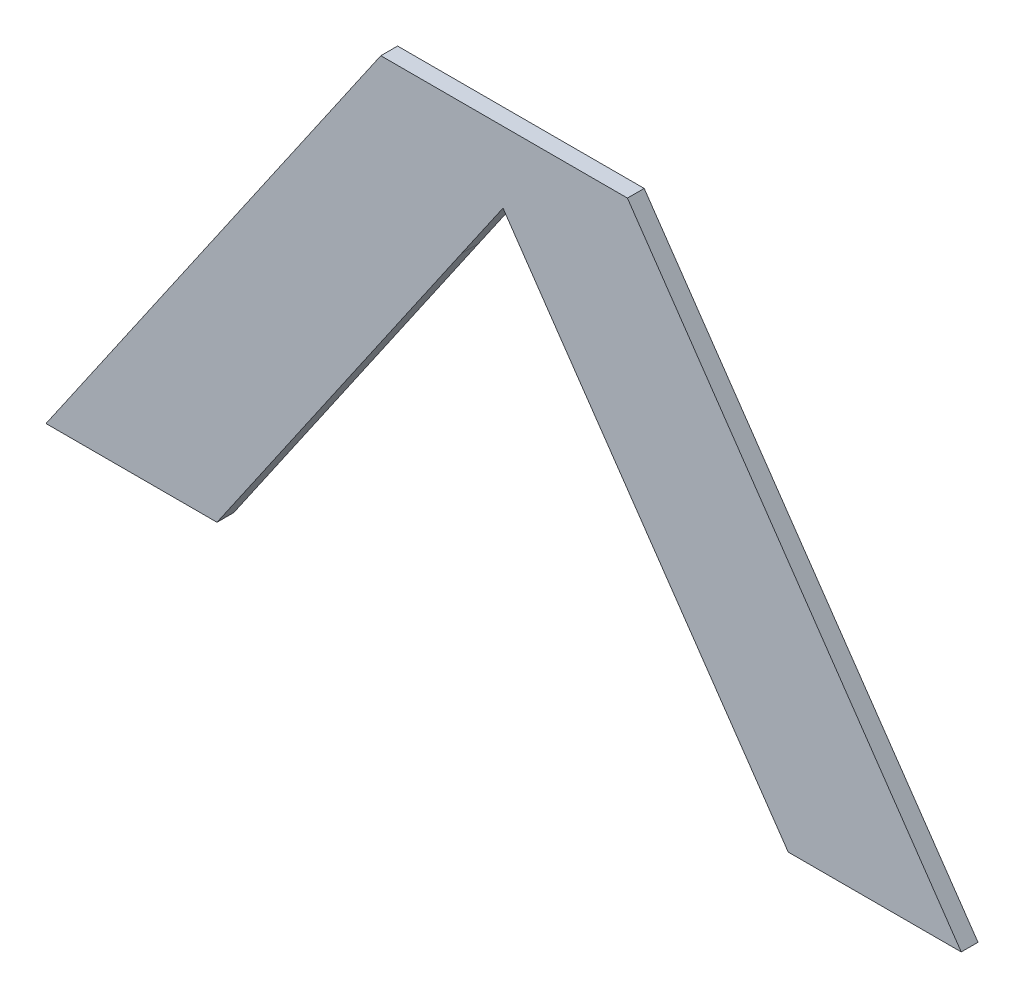
ISO-10303-21;
HEADER;
FILE_DESCRIPTION(('STEP AP214'),'2;1');
FILE_NAME('part.step','',(''),(''),'','','');
FILE_SCHEMA(('AUTOMOTIVE_DESIGN { 1 0 10303 214 1 1 1 1 }'));
ENDSEC;
DATA;
#1=APPLICATION_CONTEXT('core data for automotive mechanical design processes');
#2=APPLICATION_PROTOCOL_DEFINITION('international standard','automotive_design',2000,#1);
#3=PRODUCT_CONTEXT('',#1,'mechanical');
#4=PRODUCT('Part','Part','',(#3));
#5=PRODUCT_RELATED_PRODUCT_CATEGORY('part','',(#4));
#6=PRODUCT_DEFINITION_FORMATION('','',#4);
#7=PRODUCT_DEFINITION_CONTEXT('part definition',#1,'design');
#8=PRODUCT_DEFINITION('design','',#6,#7);
#9=PRODUCT_DEFINITION_SHAPE('','',#8);
#10=(LENGTH_UNIT() NAMED_UNIT(*) SI_UNIT(.MILLI.,.METRE.));
#11=(NAMED_UNIT(*) PLANE_ANGLE_UNIT() SI_UNIT($,.RADIAN.));
#12=(NAMED_UNIT(*) SI_UNIT($,.STERADIAN.) SOLID_ANGLE_UNIT());
#13=UNCERTAINTY_MEASURE_WITH_UNIT(LENGTH_MEASURE(1.E-05),#10,'distance_accuracy_value','');
#14=(GEOMETRIC_REPRESENTATION_CONTEXT(3) GLOBAL_UNCERTAINTY_ASSIGNED_CONTEXT((#13)) GLOBAL_UNIT_ASSIGNED_CONTEXT((#10,
#11,#12)) REPRESENTATION_CONTEXT('',''));
#15=CARTESIAN_POINT('',(0.,0.,0.));
#16=DIRECTION('',(0.,0.,1.));
#17=DIRECTION('',(1.,0.,0.));
#18=AXIS2_PLACEMENT_3D('',#15,#16,#17);
#19=CARTESIAN_POINT('',(8.50360576923078,-15.,0.5));
#20=DIRECTION('',(0.,1.,0.));
#21=DIRECTION('',(0.,0.,1.));
#22=AXIS2_PLACEMENT_3D('',#19,#20,#21);
#23=PLANE('',#22);
#24=DIRECTION('',(1.,0.,0.));
#25=VECTOR('',#24,1.);
#26=CARTESIAN_POINT('',(8.50360576923078,-15.,0.));
#27=LINE('',#26,#25);
#28=CARTESIAN_POINT('',(8.50360576923078,-15.,0.));
#29=VERTEX_POINT('',#28);
#30=CARTESIAN_POINT('',(13.6658653846154,-15.,0.));
#31=VERTEX_POINT('',#30);
#32=EDGE_CURVE('E126',#29,#31,#27,.T.);
#33=ORIENTED_EDGE('',*,*,#32,.T.);
#34=DIRECTION('',(0.,0.,-1.));
#35=VECTOR('',#34,1.);
#36=CARTESIAN_POINT('',(13.6658653846154,-15.,0.5));
#37=LINE('',#36,#35);
#38=CARTESIAN_POINT('',(13.6658653846154,-15.,0.5));
#39=VERTEX_POINT('',#38);
#40=EDGE_CURVE('E50',#39,#31,#37,.T.);
#41=ORIENTED_EDGE('',*,*,#40,.F.);
#42=DIRECTION('',(1.,0.,0.));
#43=VECTOR('',#42,1.);
#44=CARTESIAN_POINT('',(8.50360576923078,-15.,0.5));
#45=LINE('',#44,#43);
#46=CARTESIAN_POINT('',(8.50360576923078,-15.,0.5));
#47=VERTEX_POINT('',#46);
#48=EDGE_CURVE('E121',#47,#39,#45,.T.);
#49=ORIENTED_EDGE('',*,*,#48,.F.);
#50=DIRECTION('',(0.,0.,-1.));
#51=VECTOR('',#50,1.);
#52=CARTESIAN_POINT('',(8.50360576923078,-15.,0.5));
#53=LINE('',#52,#51);
#54=EDGE_CURVE('E120',#47,#29,#53,.T.);
#55=ORIENTED_EDGE('',*,*,#54,.T.);
#56=EDGE_LOOP('',(#33,#41,#49,#55));
#57=FACE_BOUND('',#56,.T.);
#58=ADVANCED_FACE('F39',(#57),#23,.F.);
#59=CARTESIAN_POINT('',(1.40625000000002,-4.67548076923077,0.5));
#60=DIRECTION('',(0.824069914439489,0.566488107656016,0.));
#61=DIRECTION('',(-0.566488107656016,0.824069914439489,0.));
#62=AXIS2_PLACEMENT_3D('',#59,#60,#61);
#63=PLANE('',#62);
#64=DIRECTION('',(0.566488107656016,-0.824069914439489,0.));
#65=VECTOR('',#64,1.);
#66=CARTESIAN_POINT('',(1.40625000000002,-4.67548076923077,0.));
#67=LINE('',#66,#65);
#68=CARTESIAN_POINT('',(1.40625000000002,-4.67548076923077,0.));
#69=VERTEX_POINT('',#68);
#70=EDGE_CURVE('E114',#69,#29,#67,.T.);
#71=ORIENTED_EDGE('',*,*,#70,.T.);
#72=ORIENTED_EDGE('',*,*,#54,.F.);
#73=DIRECTION('',(0.566488107656016,-0.824069914439489,0.));
#74=VECTOR('',#73,1.);
#75=CARTESIAN_POINT('',(1.40625000000002,-4.67548076923077,0.5));
#76=LINE('',#75,#74);
#77=CARTESIAN_POINT('',(1.40625000000002,-4.67548076923077,0.5));
#78=VERTEX_POINT('',#77);
#79=EDGE_CURVE('E127',#78,#47,#76,.T.);
#80=ORIENTED_EDGE('',*,*,#79,.F.);
#81=DIRECTION('',(0.,0.,-1.));
#82=VECTOR('',#81,1.);
#83=CARTESIAN_POINT('',(1.40625000000002,-4.67548076923077,0.5));
#84=LINE('',#83,#82);
#85=EDGE_CURVE('E118',#78,#69,#84,.T.);
#86=ORIENTED_EDGE('',*,*,#85,.T.);
#87=EDGE_LOOP('',(#71,#72,#80,#86));
#88=FACE_BOUND('',#87,.T.);
#89=ADVANCED_FACE('F117',(#88),#63,.F.);
#90=CARTESIAN_POINT('',(-0.00600961538459871,-2.61418269230769,0.5));
#91=CARTESIAN_POINT('',(0.147818769255252,-2.83882855750793,0.5));
#92=CARTESIAN_POINT('',(0.430994040341786,-3.25236832083238,0.5));
#93=CARTESIAN_POINT('',(0.825162113067454,-3.81547987688097,0.5));
#94=CARTESIAN_POINT('',(1.13620989985131,-4.2819446130016,0.5));
#95=CARTESIAN_POINT('',(1.32388466449309,-4.55544771664313,0.5));
#96=CARTESIAN_POINT('',(1.40625000000002,-4.67548076923077,0.5));
#97=B_SPLINE_CURVE_WITH_KNOTS('',3,(#90,#91,#92,#93,#94,#95,#96),.UNSPECIFIED.,.F.,.F.,(4,1,1,1,
4),(0.,0.326889026393692,0.601754278841118,0.825220814849247,1.),.UNSPECIFIED.);
#98=DIRECTION('',(0.,0.,-1.));
#99=VECTOR('',#98,1.);
#100=SURFACE_OF_LINEAR_EXTRUSION('',#97,#99);
#101=CARTESIAN_POINT('',(-0.00600961538459871,-2.61418269230769,0.));
#102=CARTESIAN_POINT('',(0.147818769255252,-2.83882855750793,0.));
#103=CARTESIAN_POINT('',(0.430994040341786,-3.25236832083238,0.));
#104=CARTESIAN_POINT('',(0.825162113067454,-3.81547987688097,0.));
#105=CARTESIAN_POINT('',(1.13620989985131,-4.2819446130016,0.));
#106=CARTESIAN_POINT('',(1.32388466449309,-4.55544771664313,0.));
#107=CARTESIAN_POINT('',(1.40625000000002,-4.67548076923077,0.));
#108=B_SPLINE_CURVE_WITH_KNOTS('',3,(#101,#102,#103,#104,#105,#106,#107),.UNSPECIFIED.,.F.,.F.,
(4,1,1,1,4),(0.,0.326889026393692,0.601754278841118,0.825220814849247,1.),.UNSPECIFIED.);
#109=CARTESIAN_POINT('',(-0.00600961538459871,-2.61418269230769,0.));
#110=VERTEX_POINT('',#109);
#111=EDGE_CURVE('E110',#110,#69,#108,.T.);
#112=ORIENTED_EDGE('',*,*,#111,.T.);
#113=ORIENTED_EDGE('',*,*,#85,.F.);
#114=CARTESIAN_POINT('',(-0.00600961538459871,-2.61418269230769,0.5));
#115=VERTEX_POINT('',#114);
#116=EDGE_CURVE('E195',#115,#78,#97,.T.);
#117=ORIENTED_EDGE('',*,*,#116,.F.);
#118=DIRECTION('',(0.,0.,-1.));
#119=VECTOR('',#118,1.);
#120=CARTESIAN_POINT('',(-0.00600961538459871,-2.61418269230769,0.5));
#121=LINE('',#120,#119);
#122=EDGE_CURVE('E164',#115,#110,#121,.T.);
#123=ORIENTED_EDGE('',*,*,#122,.T.);
#124=EDGE_LOOP('',(#112,#113,#117,#123));
#125=FACE_BOUND('',#124,.T.);
#126=ADVANCED_FACE('F203',(#125),#100,.F.);
#127=CARTESIAN_POINT('',(-1.23798076923075,-4.39903846153846,0.5));
#128=CARTESIAN_POINT('',(-1.02932484023544,-4.09878034767353,0.5));
#129=CARTESIAN_POINT('',(-0.616783506515367,-3.50512895540038,0.5));
#130=CARTESIAN_POINT('',(-0.208025320126221,-2.90886643671655,0.5));
#131=CARTESIAN_POINT('',(-0.00600961538459871,-2.61418269230769,0.5));
#132=B_SPLINE_CURVE_WITH_KNOTS('',3,(#127,#128,#129,#130,#131),.UNSPECIFIED.,.F.,.F.,(4,1,4),
(0.,0.505781874300373,1.),.UNSPECIFIED.);
#133=DIRECTION('',(0.,0.,-1.));
#134=VECTOR('',#133,1.);
#135=SURFACE_OF_LINEAR_EXTRUSION('',#132,#134);
#136=CARTESIAN_POINT('',(-1.23798076923075,-4.39903846153846,0.));
#137=CARTESIAN_POINT('',(-1.02932484023544,-4.09878034767353,0.));
#138=CARTESIAN_POINT('',(-0.616783506515367,-3.50512895540038,0.));
#139=CARTESIAN_POINT('',(-0.208025320126221,-2.90886643671655,0.));
#140=CARTESIAN_POINT('',(-0.00600961538459871,-2.61418269230769,0.));
#141=B_SPLINE_CURVE_WITH_KNOTS('',3,(#136,#137,#138,#139,#140),.UNSPECIFIED.,.F.,.F.,(4,1,4),
(0.,0.505781874300373,1.),.UNSPECIFIED.);
#142=CARTESIAN_POINT('',(-1.23798076923075,-4.39903846153846,0.));
#143=VERTEX_POINT('',#142);
#144=EDGE_CURVE('E149',#143,#110,#141,.T.);
#145=ORIENTED_EDGE('',*,*,#144,.T.);
#146=ORIENTED_EDGE('',*,*,#122,.F.);
#147=CARTESIAN_POINT('',(-1.23798076923075,-4.39903846153846,0.5));
#148=VERTEX_POINT('',#147);
#149=EDGE_CURVE('E187',#148,#115,#132,.T.);
#150=ORIENTED_EDGE('',*,*,#149,.F.);
#151=DIRECTION('',(0.,0.,-1.));
#152=VECTOR('',#151,1.);
#153=CARTESIAN_POINT('',(-1.23798076923075,-4.39903846153846,0.5));
#154=LINE('',#153,#152);
#155=EDGE_CURVE('E161',#148,#143,#154,.T.);
#156=ORIENTED_EDGE('',*,*,#155,.T.);
#157=EDGE_LOOP('',(#145,#146,#150,#156));
#158=FACE_BOUND('',#157,.T.);
#159=ADVANCED_FACE('F198',(#158),#135,.F.);
#160=CARTESIAN_POINT('',(-8.53966346153845,-15.,0.5));
#161=DIRECTION('',(-0.823551220662169,0.56724191219078,0.));
#162=DIRECTION('',(-0.56724191219078,-0.823551220662169,0.));
#163=AXIS2_PLACEMENT_3D('',#160,#161,#162);
#164=PLANE('',#163);
#165=DIRECTION('',(0.567241912190779,0.823551220662169,0.));
#166=VECTOR('',#165,1.);
#167=CARTESIAN_POINT('',(-8.53966346153845,-15.,0.));
#168=LINE('',#167,#166);
#169=CARTESIAN_POINT('',(-8.53966346153845,-15.,0.));
#170=VERTEX_POINT('',#169);
#171=EDGE_CURVE('E147',#170,#143,#168,.T.);
#172=ORIENTED_EDGE('',*,*,#171,.T.);
#173=ORIENTED_EDGE('',*,*,#155,.F.);
#174=DIRECTION('',(0.567241912190779,0.823551220662169,0.));
#175=VECTOR('',#174,1.);
#176=CARTESIAN_POINT('',(-8.53966346153845,-15.,0.5));
#177=LINE('',#176,#175);
#178=CARTESIAN_POINT('',(-8.53966346153845,-15.,0.5));
#179=VERTEX_POINT('',#178);
#180=EDGE_CURVE('E186',#179,#148,#177,.T.);
#181=ORIENTED_EDGE('',*,*,#180,.F.);
#182=DIRECTION('',(0.,0.,-1.));
#183=VECTOR('',#182,1.);
#184=CARTESIAN_POINT('',(-8.53966346153845,-15.,0.5));
#185=LINE('',#184,#183);
#186=EDGE_CURVE('E167',#179,#170,#185,.T.);
#187=ORIENTED_EDGE('',*,*,#186,.T.);
#188=EDGE_LOOP('',(#172,#173,#181,#187));
#189=FACE_BOUND('',#188,.T.);
#190=ADVANCED_FACE('F204',(#189),#164,.F.);
#191=CARTESIAN_POINT('',(-13.6418269230769,-15.,0.5));
#192=DIRECTION('',(0.,1.,0.));
#193=DIRECTION('',(0.,0.,1.));
#194=AXIS2_PLACEMENT_3D('',#191,#192,#193);
#195=PLANE('',#194);
#196=DIRECTION('',(1.,0.,0.));
#197=VECTOR('',#196,1.);
#198=CARTESIAN_POINT('',(-13.6418269230769,-15.,0.));
#199=LINE('',#198,#197);
#200=CARTESIAN_POINT('',(-13.6418269230769,-15.,0.));
#201=VERTEX_POINT('',#200);
#202=EDGE_CURVE('E143',#201,#170,#199,.T.);
#203=ORIENTED_EDGE('',*,*,#202,.T.);
#204=ORIENTED_EDGE('',*,*,#186,.F.);
#205=DIRECTION('',(1.,0.,0.));
#206=VECTOR('',#205,1.);
#207=CARTESIAN_POINT('',(-13.6418269230769,-15.,0.5));
#208=LINE('',#207,#206);
#209=CARTESIAN_POINT('',(-13.6418269230769,-15.,0.5));
#210=VERTEX_POINT('',#209);
#211=EDGE_CURVE('E182',#210,#179,#208,.T.);
#212=ORIENTED_EDGE('',*,*,#211,.F.);
#213=DIRECTION('',(0.,0.,-1.));
#214=VECTOR('',#213,1.);
#215=CARTESIAN_POINT('',(-13.6418269230769,-15.,0.5));
#216=LINE('',#215,#214);
#217=EDGE_CURVE('E169',#210,#201,#216,.T.);
#218=ORIENTED_EDGE('',*,*,#217,.T.);
#219=EDGE_LOOP('',(#203,#204,#212,#218));
#220=FACE_BOUND('',#219,.T.);
#221=ADVANCED_FACE('F208',(#220),#195,.F.);
#222=CARTESIAN_POINT('',(0.897132594726207,6.02978446737757,0.5));
#223=DIRECTION('',(0.,0.,-1.));
#224=DIRECTION('',(-1.,0.,0.));
#225=AXIS2_PLACEMENT_3D('',#222,#223,#224);
#226=PLANE('',#225);
#227=DIRECTION('',(-0.566190150909803,0.824274658722889,0.));
#228=VECTOR('',#227,1.);
#229=CARTESIAN_POINT('',(13.6658653846154,-15.,0.5));
#230=LINE('',#229,#228);
#231=CARTESIAN_POINT('',(3.70588772266454,-0.500000000000001,0.5));
#232=VERTEX_POINT('',#231);
#233=EDGE_CURVE('E172',#39,#232,#230,.T.);
#234=ORIENTED_EDGE('',*,*,#233,.T.);
#235=DIRECTION('',(-1.,0.,0.));
#236=VECTOR('',#235,1.);
#237=CARTESIAN_POINT('',(0.897132594726207,-0.5,0.5));
#238=LINE('',#237,#236);
#239=CARTESIAN_POINT('',(-3.65209578043314,-0.5,0.5));
#240=VERTEX_POINT('',#239);
#241=EDGE_CURVE('E68',#232,#240,#238,.T.);
#242=ORIENTED_EDGE('',*,*,#241,.T.);
#243=DIRECTION('',(-0.567337674702799,-0.823485253579456,0.));
#244=VECTOR('',#243,1.);
#245=CARTESIAN_POINT('',(-2.55408653846152,1.09375,0.5));
#246=LINE('',#245,#244);
#247=EDGE_CURVE('E180',#240,#210,#246,.T.);
#248=ORIENTED_EDGE('',*,*,#247,.T.);
#249=ORIENTED_EDGE('',*,*,#211,.T.);
#250=ORIENTED_EDGE('',*,*,#180,.T.);
#251=ORIENTED_EDGE('',*,*,#149,.T.);
#252=ORIENTED_EDGE('',*,*,#116,.T.);
#253=ORIENTED_EDGE('',*,*,#79,.T.);
#254=ORIENTED_EDGE('',*,*,#48,.T.);
#255=EDGE_LOOP('',(#234,#242,#248,#249,#250,#251,#252,#253,#254));
#256=FACE_BOUND('',#255,.T.);
#257=ADVANCED_FACE('F177',(#256),#226,.F.);
#258=CARTESIAN_POINT('',(-2.55408653846152,1.09375,0.5));
#259=DIRECTION('',(0.823485253579456,-0.567337674702799,0.));
#260=DIRECTION('',(0.567337674702799,0.823485253579456,0.));
#261=AXIS2_PLACEMENT_3D('',#258,#259,#260);
#262=PLANE('',#261);
#263=ORIENTED_EDGE('',*,*,#247,.F.);
#264=DIRECTION('',(0.,0.,-1.));
#265=VECTOR('',#264,1.);
#266=CARTESIAN_POINT('',(-3.65209578043314,-0.5,0.5));
#267=LINE('',#266,#265);
#268=CARTESIAN_POINT('',(-3.65209578043314,-0.5,0.));
#269=VERTEX_POINT('',#268);
#270=EDGE_CURVE('E53',#240,#269,#267,.T.);
#271=ORIENTED_EDGE('',*,*,#270,.T.);
#272=DIRECTION('',(-0.567337674702799,-0.823485253579456,0.));
#273=VECTOR('',#272,1.);
#274=CARTESIAN_POINT('',(-2.55408653846152,1.09375,0.));
#275=LINE('',#274,#273);
#276=EDGE_CURVE('E140',#269,#201,#275,.T.);
#277=ORIENTED_EDGE('',*,*,#276,.T.);
#278=ORIENTED_EDGE('',*,*,#217,.F.);
#279=EDGE_LOOP('',(#263,#271,#277,#278));
#280=FACE_BOUND('',#279,.T.);
#281=ADVANCED_FACE('F214',(#280),#262,.F.);
#282=CARTESIAN_POINT('',(13.6658653846154,-15.,0.5));
#283=DIRECTION('',(-0.824274658722889,-0.566190150909803,0.));
#284=DIRECTION('',(0.566190150909803,-0.824274658722889,0.));
#285=AXIS2_PLACEMENT_3D('',#282,#283,#284);
#286=PLANE('',#285);
#287=DIRECTION('',(-0.566190150909803,0.824274658722889,0.));
#288=VECTOR('',#287,1.);
#289=CARTESIAN_POINT('',(13.6658653846154,-15.,0.));
#290=LINE('',#289,#288);
#291=CARTESIAN_POINT('',(3.70588772266454,-0.5,0.));
#292=VERTEX_POINT('',#291);
#293=EDGE_CURVE('E132',#31,#292,#290,.T.);
#294=ORIENTED_EDGE('',*,*,#293,.T.);
#295=DIRECTION('',(0.,0.,1.));
#296=VECTOR('',#295,1.);
#297=CARTESIAN_POINT('',(3.70588772266454,-0.5,0.5));
#298=LINE('',#297,#296);
#299=EDGE_CURVE('E63',#292,#232,#298,.T.);
#300=ORIENTED_EDGE('',*,*,#299,.T.);
#301=ORIENTED_EDGE('',*,*,#233,.F.);
#302=ORIENTED_EDGE('',*,*,#40,.T.);
#303=EDGE_LOOP('',(#294,#300,#301,#302));
#304=FACE_BOUND('',#303,.T.);
#305=ADVANCED_FACE('F171',(#304),#286,.F.);
#306=CARTESIAN_POINT('',(0.897132594726207,6.02978446737757,0.));
#307=DIRECTION('',(0.,0.,-1.));
#308=DIRECTION('',(-1.,0.,0.));
#309=AXIS2_PLACEMENT_3D('',#306,#307,#308);
#310=PLANE('',#309);
#311=DIRECTION('',(-1.,0.,0.));
#312=VECTOR('',#311,1.);
#313=CARTESIAN_POINT('',(0.897132594726207,-0.5,0.));
#314=LINE('',#313,#312);
#315=EDGE_CURVE('E11',#292,#269,#314,.T.);
#316=ORIENTED_EDGE('',*,*,#315,.F.);
#317=ORIENTED_EDGE('',*,*,#293,.F.);
#318=ORIENTED_EDGE('',*,*,#32,.F.);
#319=ORIENTED_EDGE('',*,*,#70,.F.);
#320=ORIENTED_EDGE('',*,*,#111,.F.);
#321=ORIENTED_EDGE('',*,*,#144,.F.);
#322=ORIENTED_EDGE('',*,*,#171,.F.);
#323=ORIENTED_EDGE('',*,*,#202,.F.);
#324=ORIENTED_EDGE('',*,*,#276,.F.);
#325=EDGE_LOOP('',(#316,#317,#318,#319,#320,#321,#322,#323,#324));
#326=FACE_BOUND('',#325,.T.);
#327=ADVANCED_FACE('F135',(#326),#310,.T.);
#328=CARTESIAN_POINT('',(-17.,-0.5,1.));
#329=DIRECTION('',(0.,-1.,0.));
#330=DIRECTION('',(0.,0.,-1.));
#331=AXIS2_PLACEMENT_3D('',#328,#329,#330);
#332=PLANE('',#331);
#333=ORIENTED_EDGE('',*,*,#315,.T.);
#334=ORIENTED_EDGE('',*,*,#270,.F.);
#335=ORIENTED_EDGE('',*,*,#241,.F.);
#336=ORIENTED_EDGE('',*,*,#299,.F.);
#337=EDGE_LOOP('',(#333,#334,#335,#336));
#338=FACE_BOUND('',#337,.T.);
#339=ADVANCED_FACE('F222',(#338),#332,.F.);
#340=CLOSED_SHELL('',(#58,#89,#126,#159,#190,#221,#257,#281,#305,#327,#339));
#341=MANIFOLD_SOLID_BREP('B2',#340);
#342=ADVANCED_BREP_SHAPE_REPRESENTATION('',(#18,#341),#14);
#343=SHAPE_DEFINITION_REPRESENTATION(#9,#342);
ENDSEC;
END-ISO-10303-21;
